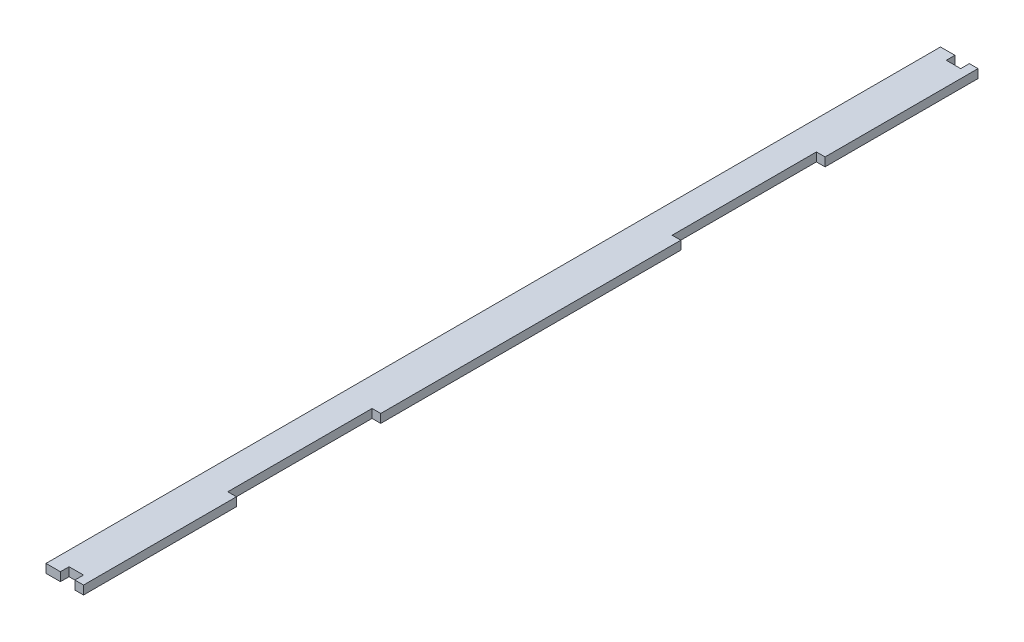
ISO-10303-21;
HEADER;
FILE_DESCRIPTION(('STEP AP214'),'2;1');
FILE_NAME('part.step','',(''),(''),'','','');
FILE_SCHEMA(('AUTOMOTIVE_DESIGN { 1 0 10303 214 1 1 1 1 }'));
ENDSEC;
DATA;
#1=APPLICATION_CONTEXT('core data for automotive mechanical design processes');
#2=APPLICATION_PROTOCOL_DEFINITION('international standard','automotive_design',2000,#1);
#3=PRODUCT_CONTEXT('',#1,'mechanical');
#4=PRODUCT('Part','Part','',(#3));
#5=PRODUCT_RELATED_PRODUCT_CATEGORY('part','',(#4));
#6=PRODUCT_DEFINITION_FORMATION('','',#4);
#7=PRODUCT_DEFINITION_CONTEXT('part definition',#1,'design');
#8=PRODUCT_DEFINITION('design','',#6,#7);
#9=PRODUCT_DEFINITION_SHAPE('','',#8);
#10=(LENGTH_UNIT() NAMED_UNIT(*) SI_UNIT(.MILLI.,.METRE.));
#11=(NAMED_UNIT(*) PLANE_ANGLE_UNIT() SI_UNIT($,.RADIAN.));
#12=(NAMED_UNIT(*) SI_UNIT($,.STERADIAN.) SOLID_ANGLE_UNIT());
#13=UNCERTAINTY_MEASURE_WITH_UNIT(LENGTH_MEASURE(1.E-05),#10,'distance_accuracy_value','');
#14=(GEOMETRIC_REPRESENTATION_CONTEXT(3) GLOBAL_UNCERTAINTY_ASSIGNED_CONTEXT((#13)) GLOBAL_UNIT_ASSIGNED_CONTEXT((#10,
#11,#12)) REPRESENTATION_CONTEXT('',''));
#15=CARTESIAN_POINT('',(0.,0.,0.));
#16=DIRECTION('',(0.,0.,1.));
#17=DIRECTION('',(1.,0.,0.));
#18=AXIS2_PLACEMENT_3D('',#15,#16,#17);
#19=CARTESIAN_POINT('',(1.40934689520758,3.,-179.845654020116));
#20=DIRECTION('',(1.,0.,0.));
#21=DIRECTION('',(0.,0.,-1.));
#22=AXIS2_PLACEMENT_3D('',#19,#20,#21);
#23=PLANE('',#22);
#24=DIRECTION('',(0.,0.,1.));
#25=VECTOR('',#24,1.);
#26=CARTESIAN_POINT('',(1.40934689520758,0.,-179.845654020116));
#27=LINE('',#26,#25);
#28=CARTESIAN_POINT('',(1.40934689520758,0.,-179.845654020116));
#29=VERTEX_POINT('',#28);
#30=CARTESIAN_POINT('',(1.40934689520761,0.,130.154345979884));
#31=VERTEX_POINT('',#30);
#32=EDGE_CURVE('E212',#29,#31,#27,.T.);
#33=ORIENTED_EDGE('',*,*,#32,.T.);
#34=DIRECTION('',(0.,-1.,0.));
#35=VECTOR('',#34,1.);
#36=CARTESIAN_POINT('',(1.40934689520761,3.,130.154345979884));
#37=LINE('',#36,#35);
#38=CARTESIAN_POINT('',(1.40934689520761,3.,130.154345979884));
#39=VERTEX_POINT('',#38);
#40=EDGE_CURVE('E11',#39,#31,#37,.T.);
#41=ORIENTED_EDGE('',*,*,#40,.F.);
#42=DIRECTION('',(0.,0.,1.));
#43=VECTOR('',#42,1.);
#44=CARTESIAN_POINT('',(1.40934689520758,3.,-179.845654020116));
#45=LINE('',#44,#43);
#46=CARTESIAN_POINT('',(1.40934689520758,3.,-179.845654020116));
#47=VERTEX_POINT('',#46);
#48=EDGE_CURVE('E270',#47,#39,#45,.T.);
#49=ORIENTED_EDGE('',*,*,#48,.F.);
#50=DIRECTION('',(0.,-1.,0.));
#51=VECTOR('',#50,1.);
#52=CARTESIAN_POINT('',(1.40934689520758,3.,-179.845654020116));
#53=LINE('',#52,#51);
#54=EDGE_CURVE('E208',#47,#29,#53,.T.);
#55=ORIENTED_EDGE('',*,*,#54,.T.);
#56=EDGE_LOOP('',(#33,#41,#49,#55));
#57=FACE_BOUND('',#56,.T.);
#58=ADVANCED_FACE('F39',(#57),#23,.F.);
#59=CARTESIAN_POINT('',(1.40934689520761,3.,130.154345979884));
#60=DIRECTION('',(0.,0.,-1.));
#61=DIRECTION('',(-1.,0.,0.));
#62=AXIS2_PLACEMENT_3D('',#59,#60,#61);
#63=PLANE('',#62);
#64=DIRECTION('',(1.,0.,0.));
#65=VECTOR('',#64,1.);
#66=CARTESIAN_POINT('',(1.40934689520761,0.,130.154345979884));
#67=LINE('',#66,#65);
#68=CARTESIAN_POINT('',(6.40934689520761,0.,130.154345979884));
#69=VERTEX_POINT('',#68);
#70=EDGE_CURVE('E216',#31,#69,#67,.T.);
#71=ORIENTED_EDGE('',*,*,#70,.T.);
#72=DIRECTION('',(0.,-1.,0.));
#73=VECTOR('',#72,1.);
#74=CARTESIAN_POINT('',(6.40934689520761,3.,130.154345979884));
#75=LINE('',#74,#73);
#76=CARTESIAN_POINT('',(6.40934689520761,3.,130.154345979884));
#77=VERTEX_POINT('',#76);
#78=EDGE_CURVE('E48',#77,#69,#75,.T.);
#79=ORIENTED_EDGE('',*,*,#78,.F.);
#80=DIRECTION('',(1.,0.,0.));
#81=VECTOR('',#80,1.);
#82=CARTESIAN_POINT('',(1.40934689520761,3.,130.154345979884));
#83=LINE('',#82,#81);
#84=EDGE_CURVE('E135',#39,#77,#83,.T.);
#85=ORIENTED_EDGE('',*,*,#84,.F.);
#86=ORIENTED_EDGE('',*,*,#40,.T.);
#87=EDGE_LOOP('',(#71,#79,#85,#86));
#88=FACE_BOUND('',#87,.T.);
#89=ADVANCED_FACE('F420',(#88),#63,.F.);
#90=CARTESIAN_POINT('',(6.40934689520761,3.,130.154345979884));
#91=DIRECTION('',(-1.,0.,0.));
#92=DIRECTION('',(0.,0.,1.));
#93=AXIS2_PLACEMENT_3D('',#90,#91,#92);
#94=PLANE('',#93);
#95=DIRECTION('',(0.,0.,-1.));
#96=VECTOR('',#95,1.);
#97=CARTESIAN_POINT('',(6.40934689520761,0.,130.154345979884));
#98=LINE('',#97,#96);
#99=CARTESIAN_POINT('',(6.40934689520761,0.,127.154345979884));
#100=VERTEX_POINT('',#99);
#101=EDGE_CURVE('E219',#69,#100,#98,.T.);
#102=ORIENTED_EDGE('',*,*,#101,.T.);
#103=DIRECTION('',(0.,-1.,0.));
#104=VECTOR('',#103,1.);
#105=CARTESIAN_POINT('',(6.40934689520761,3.,127.154345979884));
#106=LINE('',#105,#104);
#107=CARTESIAN_POINT('',(6.40934689520761,3.,127.154345979884));
#108=VERTEX_POINT('',#107);
#109=EDGE_CURVE('E329',#108,#100,#106,.T.);
#110=ORIENTED_EDGE('',*,*,#109,.F.);
#111=DIRECTION('',(0.,0.,-1.));
#112=VECTOR('',#111,1.);
#113=CARTESIAN_POINT('',(6.40934689520761,3.,130.154345979884));
#114=LINE('',#113,#112);
#115=EDGE_CURVE('E339',#77,#108,#114,.T.);
#116=ORIENTED_EDGE('',*,*,#115,.F.);
#117=ORIENTED_EDGE('',*,*,#78,.T.);
#118=EDGE_LOOP('',(#102,#110,#116,#117));
#119=FACE_BOUND('',#118,.T.);
#120=ADVANCED_FACE('F337',(#119),#94,.F.);
#121=CARTESIAN_POINT('',(6.40934689520761,3.,127.154345979884));
#122=DIRECTION('',(0.,0.,-1.));
#123=DIRECTION('',(-1.,0.,0.));
#124=AXIS2_PLACEMENT_3D('',#121,#122,#123);
#125=PLANE('',#124);
#126=DIRECTION('',(1.,0.,0.));
#127=VECTOR('',#126,1.);
#128=CARTESIAN_POINT('',(6.40934689520761,0.,127.154345979884));
#129=LINE('',#128,#127);
#130=CARTESIAN_POINT('',(11.4093468952076,0.,127.154345979884));
#131=VERTEX_POINT('',#130);
#132=EDGE_CURVE('E222',#100,#131,#129,.T.);
#133=ORIENTED_EDGE('',*,*,#132,.T.);
#134=DIRECTION('',(0.,-1.,0.));
#135=VECTOR('',#134,1.);
#136=CARTESIAN_POINT('',(11.4093468952076,3.,127.154345979884));
#137=LINE('',#136,#135);
#138=CARTESIAN_POINT('',(11.4093468952076,3.,127.154345979884));
#139=VERTEX_POINT('',#138);
#140=EDGE_CURVE('E325',#139,#131,#137,.T.);
#141=ORIENTED_EDGE('',*,*,#140,.F.);
#142=DIRECTION('',(1.,0.,0.));
#143=VECTOR('',#142,1.);
#144=CARTESIAN_POINT('',(6.40934689520761,3.,127.154345979884));
#145=LINE('',#144,#143);
#146=EDGE_CURVE('E358',#108,#139,#145,.T.);
#147=ORIENTED_EDGE('',*,*,#146,.F.);
#148=ORIENTED_EDGE('',*,*,#109,.T.);
#149=EDGE_LOOP('',(#133,#141,#147,#148));
#150=FACE_BOUND('',#149,.T.);
#151=ADVANCED_FACE('F348',(#150),#125,.F.);
#152=CARTESIAN_POINT('',(11.4093468952076,3.,127.154345979884));
#153=DIRECTION('',(1.,0.,0.));
#154=DIRECTION('',(0.,0.,-1.));
#155=AXIS2_PLACEMENT_3D('',#152,#153,#154);
#156=PLANE('',#155);
#157=DIRECTION('',(0.,0.,1.));
#158=VECTOR('',#157,1.);
#159=CARTESIAN_POINT('',(11.4093468952076,0.,127.154345979884));
#160=LINE('',#159,#158);
#161=CARTESIAN_POINT('',(11.4093468952076,0.,130.154345979884));
#162=VERTEX_POINT('',#161);
#163=EDGE_CURVE('E225',#131,#162,#160,.T.);
#164=ORIENTED_EDGE('',*,*,#163,.T.);
#165=DIRECTION('',(0.,-1.,0.));
#166=VECTOR('',#165,1.);
#167=CARTESIAN_POINT('',(11.4093468952076,3.,130.154345979884));
#168=LINE('',#167,#166);
#169=CARTESIAN_POINT('',(11.4093468952076,3.,130.154345979884));
#170=VERTEX_POINT('',#169);
#171=EDGE_CURVE('E321',#170,#162,#168,.T.);
#172=ORIENTED_EDGE('',*,*,#171,.F.);
#173=DIRECTION('',(0.,0.,1.));
#174=VECTOR('',#173,1.);
#175=CARTESIAN_POINT('',(11.4093468952076,3.,127.154345979884));
#176=LINE('',#175,#174);
#177=EDGE_CURVE('E354',#139,#170,#176,.T.);
#178=ORIENTED_EDGE('',*,*,#177,.F.);
#179=ORIENTED_EDGE('',*,*,#140,.T.);
#180=EDGE_LOOP('',(#164,#172,#178,#179));
#181=FACE_BOUND('',#180,.T.);
#182=ADVANCED_FACE('F352',(#181),#156,.F.);
#183=CARTESIAN_POINT('',(11.4093468952076,3.,130.154345979884));
#184=DIRECTION('',(0.,0.,-1.));
#185=DIRECTION('',(-1.,0.,0.));
#186=AXIS2_PLACEMENT_3D('',#183,#184,#185);
#187=PLANE('',#186);
#188=DIRECTION('',(1.,0.,0.));
#189=VECTOR('',#188,1.);
#190=CARTESIAN_POINT('',(11.4093468952076,0.,130.154345979884));
#191=LINE('',#190,#189);
#192=CARTESIAN_POINT('',(14.4093468952076,0.,130.154345979884));
#193=VERTEX_POINT('',#192);
#194=EDGE_CURVE('E228',#162,#193,#191,.T.);
#195=ORIENTED_EDGE('',*,*,#194,.T.);
#196=DIRECTION('',(0.,-1.,0.));
#197=VECTOR('',#196,1.);
#198=CARTESIAN_POINT('',(14.4093468952076,3.,130.154345979884));
#199=LINE('',#198,#197);
#200=CARTESIAN_POINT('',(14.4093468952076,3.,130.154345979884));
#201=VERTEX_POINT('',#200);
#202=EDGE_CURVE('E317',#201,#193,#199,.T.);
#203=ORIENTED_EDGE('',*,*,#202,.F.);
#204=DIRECTION('',(1.,0.,0.));
#205=VECTOR('',#204,1.);
#206=CARTESIAN_POINT('',(11.4093468952076,3.,130.154345979884));
#207=LINE('',#206,#205);
#208=EDGE_CURVE('E357',#170,#201,#207,.T.);
#209=ORIENTED_EDGE('',*,*,#208,.F.);
#210=ORIENTED_EDGE('',*,*,#171,.T.);
#211=EDGE_LOOP('',(#195,#203,#209,#210));
#212=FACE_BOUND('',#211,.T.);
#213=ADVANCED_FACE('F433',(#212),#187,.F.);
#214=CARTESIAN_POINT('',(14.4093468952076,3.,77.1543459798844));
#215=DIRECTION('',(-1.,0.,0.));
#216=DIRECTION('',(0.,0.,1.));
#217=AXIS2_PLACEMENT_3D('',#214,#215,#216);
#218=PLANE('',#217);
#219=DIRECTION('',(0.,0.,-1.));
#220=VECTOR('',#219,1.);
#221=CARTESIAN_POINT('',(14.4093468952076,0.,77.1543459798844));
#222=LINE('',#221,#220);
#223=CARTESIAN_POINT('',(14.4093468952076,0.,77.1543459798844));
#224=VERTEX_POINT('',#223);
#225=EDGE_CURVE('E231',#193,#224,#222,.T.);
#226=ORIENTED_EDGE('',*,*,#225,.T.);
#227=DIRECTION('',(0.,-1.,0.));
#228=VECTOR('',#227,1.);
#229=CARTESIAN_POINT('',(14.4093468952076,3.,77.1543459798844));
#230=LINE('',#229,#228);
#231=CARTESIAN_POINT('',(14.4093468952076,3.,77.1543459798844));
#232=VERTEX_POINT('',#231);
#233=EDGE_CURVE('E313',#232,#224,#230,.T.);
#234=ORIENTED_EDGE('',*,*,#233,.F.);
#235=DIRECTION('',(0.,0.,-1.));
#236=VECTOR('',#235,1.);
#237=CARTESIAN_POINT('',(14.4093468952076,3.,77.1543459798844));
#238=LINE('',#237,#236);
#239=EDGE_CURVE('E362',#201,#232,#238,.T.);
#240=ORIENTED_EDGE('',*,*,#239,.F.);
#241=ORIENTED_EDGE('',*,*,#202,.T.);
#242=EDGE_LOOP('',(#226,#234,#240,#241));
#243=FACE_BOUND('',#242,.T.);
#244=ADVANCED_FACE('F436',(#243),#218,.F.);
#245=CARTESIAN_POINT('',(14.4093468952076,3.,77.1543459798844));
#246=DIRECTION('',(0.,0.,1.));
#247=DIRECTION('',(1.,0.,0.));
#248=AXIS2_PLACEMENT_3D('',#245,#246,#247);
#249=PLANE('',#248);
#250=DIRECTION('',(-1.,0.,0.));
#251=VECTOR('',#250,1.);
#252=CARTESIAN_POINT('',(14.4093468952076,0.,77.1543459798844));
#253=LINE('',#252,#251);
#254=CARTESIAN_POINT('',(11.4093468952076,0.,77.1543459798844));
#255=VERTEX_POINT('',#254);
#256=EDGE_CURVE('E234',#224,#255,#253,.T.);
#257=ORIENTED_EDGE('',*,*,#256,.T.);
#258=DIRECTION('',(0.,-1.,0.));
#259=VECTOR('',#258,1.);
#260=CARTESIAN_POINT('',(11.4093468952076,3.,77.1543459798844));
#261=LINE('',#260,#259);
#262=CARTESIAN_POINT('',(11.4093468952076,3.,77.1543459798844));
#263=VERTEX_POINT('',#262);
#264=EDGE_CURVE('E309',#263,#255,#261,.T.);
#265=ORIENTED_EDGE('',*,*,#264,.F.);
#266=DIRECTION('',(-1.,0.,0.));
#267=VECTOR('',#266,1.);
#268=CARTESIAN_POINT('',(14.4093468952076,3.,77.1543459798844));
#269=LINE('',#268,#267);
#270=EDGE_CURVE('E369',#232,#263,#269,.T.);
#271=ORIENTED_EDGE('',*,*,#270,.F.);
#272=ORIENTED_EDGE('',*,*,#233,.T.);
#273=EDGE_LOOP('',(#257,#265,#271,#272));
#274=FACE_BOUND('',#273,.T.);
#275=ADVANCED_FACE('F440',(#274),#249,.F.);
#276=CARTESIAN_POINT('',(11.4093468952076,3.,77.1543459798844));
#277=DIRECTION('',(-1.,0.,0.));
#278=DIRECTION('',(0.,0.,1.));
#279=AXIS2_PLACEMENT_3D('',#276,#277,#278);
#280=PLANE('',#279);
#281=DIRECTION('',(0.,0.,-1.));
#282=VECTOR('',#281,1.);
#283=CARTESIAN_POINT('',(11.4093468952076,0.,77.1543459798844));
#284=LINE('',#283,#282);
#285=CARTESIAN_POINT('',(11.4093468952076,0.,27.1543459798844));
#286=VERTEX_POINT('',#285);
#287=EDGE_CURVE('E237',#255,#286,#284,.T.);
#288=ORIENTED_EDGE('',*,*,#287,.T.);
#289=DIRECTION('',(0.,-1.,0.));
#290=VECTOR('',#289,1.);
#291=CARTESIAN_POINT('',(11.4093468952076,3.,27.1543459798844));
#292=LINE('',#291,#290);
#293=CARTESIAN_POINT('',(11.4093468952076,3.,27.1543459798844));
#294=VERTEX_POINT('',#293);
#295=EDGE_CURVE('E305',#294,#286,#292,.T.);
#296=ORIENTED_EDGE('',*,*,#295,.F.);
#297=DIRECTION('',(0.,0.,-1.));
#298=VECTOR('',#297,1.);
#299=CARTESIAN_POINT('',(11.4093468952076,3.,77.1543459798844));
#300=LINE('',#299,#298);
#301=EDGE_CURVE('E372',#263,#294,#300,.T.);
#302=ORIENTED_EDGE('',*,*,#301,.F.);
#303=ORIENTED_EDGE('',*,*,#264,.T.);
#304=EDGE_LOOP('',(#288,#296,#302,#303));
#305=FACE_BOUND('',#304,.T.);
#306=ADVANCED_FACE('F444',(#305),#280,.F.);
#307=CARTESIAN_POINT('',(11.4093468952076,3.,27.1543459798844));
#308=DIRECTION('',(0.,0.,-1.));
#309=DIRECTION('',(-1.,0.,0.));
#310=AXIS2_PLACEMENT_3D('',#307,#308,#309);
#311=PLANE('',#310);
#312=DIRECTION('',(1.,0.,0.));
#313=VECTOR('',#312,1.);
#314=CARTESIAN_POINT('',(11.4093468952076,0.,27.1543459798844));
#315=LINE('',#314,#313);
#316=CARTESIAN_POINT('',(14.4093468952076,0.,27.1543459798844));
#317=VERTEX_POINT('',#316);
#318=EDGE_CURVE('E240',#286,#317,#315,.T.);
#319=ORIENTED_EDGE('',*,*,#318,.T.);
#320=DIRECTION('',(0.,-1.,0.));
#321=VECTOR('',#320,1.);
#322=CARTESIAN_POINT('',(14.4093468952076,3.,27.1543459798844));
#323=LINE('',#322,#321);
#324=CARTESIAN_POINT('',(14.4093468952076,3.,27.1543459798844));
#325=VERTEX_POINT('',#324);
#326=EDGE_CURVE('E301',#325,#317,#323,.T.);
#327=ORIENTED_EDGE('',*,*,#326,.F.);
#328=DIRECTION('',(1.,0.,0.));
#329=VECTOR('',#328,1.);
#330=CARTESIAN_POINT('',(11.4093468952076,3.,27.1543459798844));
#331=LINE('',#330,#329);
#332=EDGE_CURVE('E375',#294,#325,#331,.T.);
#333=ORIENTED_EDGE('',*,*,#332,.F.);
#334=ORIENTED_EDGE('',*,*,#295,.T.);
#335=EDGE_LOOP('',(#319,#327,#333,#334));
#336=FACE_BOUND('',#335,.T.);
#337=ADVANCED_FACE('F448',(#336),#311,.F.);
#338=CARTESIAN_POINT('',(14.4093468952076,3.,-76.8456540201156));
#339=DIRECTION('',(-1.,0.,0.));
#340=DIRECTION('',(0.,0.,1.));
#341=AXIS2_PLACEMENT_3D('',#338,#339,#340);
#342=PLANE('',#341);
#343=DIRECTION('',(0.,0.,-1.));
#344=VECTOR('',#343,1.);
#345=CARTESIAN_POINT('',(14.4093468952076,0.,-76.8456540201156));
#346=LINE('',#345,#344);
#347=CARTESIAN_POINT('',(14.4093468952076,0.,-76.8456540201156));
#348=VERTEX_POINT('',#347);
#349=EDGE_CURVE('E243',#317,#348,#346,.T.);
#350=ORIENTED_EDGE('',*,*,#349,.T.);
#351=DIRECTION('',(0.,-1.,0.));
#352=VECTOR('',#351,1.);
#353=CARTESIAN_POINT('',(14.4093468952076,3.,-76.8456540201156));
#354=LINE('',#353,#352);
#355=CARTESIAN_POINT('',(14.4093468952076,3.,-76.8456540201156));
#356=VERTEX_POINT('',#355);
#357=EDGE_CURVE('E297',#356,#348,#354,.T.);
#358=ORIENTED_EDGE('',*,*,#357,.F.);
#359=DIRECTION('',(0.,0.,-1.));
#360=VECTOR('',#359,1.);
#361=CARTESIAN_POINT('',(14.4093468952076,3.,-76.8456540201156));
#362=LINE('',#361,#360);
#363=EDGE_CURVE('E378',#325,#356,#362,.T.);
#364=ORIENTED_EDGE('',*,*,#363,.F.);
#365=ORIENTED_EDGE('',*,*,#326,.T.);
#366=EDGE_LOOP('',(#350,#358,#364,#365));
#367=FACE_BOUND('',#366,.T.);
#368=ADVANCED_FACE('F452',(#367),#342,.F.);
#369=CARTESIAN_POINT('',(11.4093468952076,3.,-76.8456540201156));
#370=DIRECTION('',(0.,0.,1.));
#371=DIRECTION('',(1.,0.,0.));
#372=AXIS2_PLACEMENT_3D('',#369,#370,#371);
#373=PLANE('',#372);
#374=DIRECTION('',(-1.,0.,0.));
#375=VECTOR('',#374,1.);
#376=CARTESIAN_POINT('',(11.4093468952076,0.,-76.8456540201156));
#377=LINE('',#376,#375);
#378=CARTESIAN_POINT('',(11.4093468952076,0.,-76.8456540201156));
#379=VERTEX_POINT('',#378);
#380=EDGE_CURVE('E246',#348,#379,#377,.T.);
#381=ORIENTED_EDGE('',*,*,#380,.T.);
#382=DIRECTION('',(0.,-1.,0.));
#383=VECTOR('',#382,1.);
#384=CARTESIAN_POINT('',(11.4093468952076,3.,-76.8456540201156));
#385=LINE('',#384,#383);
#386=CARTESIAN_POINT('',(11.4093468952076,3.,-76.8456540201156));
#387=VERTEX_POINT('',#386);
#388=EDGE_CURVE('E293',#387,#379,#385,.T.);
#389=ORIENTED_EDGE('',*,*,#388,.F.);
#390=DIRECTION('',(-1.,0.,0.));
#391=VECTOR('',#390,1.);
#392=CARTESIAN_POINT('',(11.4093468952076,3.,-76.8456540201156));
#393=LINE('',#392,#391);
#394=EDGE_CURVE('E381',#356,#387,#393,.T.);
#395=ORIENTED_EDGE('',*,*,#394,.F.);
#396=ORIENTED_EDGE('',*,*,#357,.T.);
#397=EDGE_LOOP('',(#381,#389,#395,#396));
#398=FACE_BOUND('',#397,.T.);
#399=ADVANCED_FACE('F456',(#398),#373,.F.);
#400=CARTESIAN_POINT('',(11.4093468952076,3.,-126.845654020116));
#401=DIRECTION('',(-1.,0.,0.));
#402=DIRECTION('',(0.,0.,1.));
#403=AXIS2_PLACEMENT_3D('',#400,#401,#402);
#404=PLANE('',#403);
#405=DIRECTION('',(0.,0.,-1.));
#406=VECTOR('',#405,1.);
#407=CARTESIAN_POINT('',(11.4093468952076,0.,-126.845654020116));
#408=LINE('',#407,#406);
#409=CARTESIAN_POINT('',(11.4093468952076,0.,-126.845654020116));
#410=VERTEX_POINT('',#409);
#411=EDGE_CURVE('E249',#379,#410,#408,.T.);
#412=ORIENTED_EDGE('',*,*,#411,.T.);
#413=DIRECTION('',(0.,-1.,0.));
#414=VECTOR('',#413,1.);
#415=CARTESIAN_POINT('',(11.4093468952076,3.,-126.845654020116));
#416=LINE('',#415,#414);
#417=CARTESIAN_POINT('',(11.4093468952076,3.,-126.845654020116));
#418=VERTEX_POINT('',#417);
#419=EDGE_CURVE('E289',#418,#410,#416,.T.);
#420=ORIENTED_EDGE('',*,*,#419,.F.);
#421=DIRECTION('',(0.,0.,-1.));
#422=VECTOR('',#421,1.);
#423=CARTESIAN_POINT('',(11.4093468952076,3.,-126.845654020116));
#424=LINE('',#423,#422);
#425=EDGE_CURVE('E384',#387,#418,#424,.T.);
#426=ORIENTED_EDGE('',*,*,#425,.F.);
#427=ORIENTED_EDGE('',*,*,#388,.T.);
#428=EDGE_LOOP('',(#412,#420,#426,#427));
#429=FACE_BOUND('',#428,.T.);
#430=ADVANCED_FACE('F460',(#429),#404,.F.);
#431=CARTESIAN_POINT('',(14.4093468952076,3.,-126.845654020116));
#432=DIRECTION('',(0.,0.,-1.));
#433=DIRECTION('',(-1.,0.,0.));
#434=AXIS2_PLACEMENT_3D('',#431,#432,#433);
#435=PLANE('',#434);
#436=DIRECTION('',(1.,0.,0.));
#437=VECTOR('',#436,1.);
#438=CARTESIAN_POINT('',(14.4093468952076,0.,-126.845654020116));
#439=LINE('',#438,#437);
#440=CARTESIAN_POINT('',(14.4093468952076,0.,-126.845654020116));
#441=VERTEX_POINT('',#440);
#442=EDGE_CURVE('E252',#410,#441,#439,.T.);
#443=ORIENTED_EDGE('',*,*,#442,.T.);
#444=DIRECTION('',(0.,-1.,0.));
#445=VECTOR('',#444,1.);
#446=CARTESIAN_POINT('',(14.4093468952076,3.,-126.845654020116));
#447=LINE('',#446,#445);
#448=CARTESIAN_POINT('',(14.4093468952076,3.,-126.845654020116));
#449=VERTEX_POINT('',#448);
#450=EDGE_CURVE('E285',#449,#441,#447,.T.);
#451=ORIENTED_EDGE('',*,*,#450,.F.);
#452=DIRECTION('',(1.,0.,0.));
#453=VECTOR('',#452,1.);
#454=CARTESIAN_POINT('',(14.4093468952076,3.,-126.845654020116));
#455=LINE('',#454,#453);
#456=EDGE_CURVE('E387',#418,#449,#455,.T.);
#457=ORIENTED_EDGE('',*,*,#456,.F.);
#458=ORIENTED_EDGE('',*,*,#419,.T.);
#459=EDGE_LOOP('',(#443,#451,#457,#458));
#460=FACE_BOUND('',#459,.T.);
#461=ADVANCED_FACE('F464',(#460),#435,.F.);
#462=CARTESIAN_POINT('',(14.4093468952076,3.,-179.845654020116));
#463=DIRECTION('',(-1.,0.,0.));
#464=DIRECTION('',(0.,0.,1.));
#465=AXIS2_PLACEMENT_3D('',#462,#463,#464);
#466=PLANE('',#465);
#467=DIRECTION('',(0.,0.,-1.));
#468=VECTOR('',#467,1.);
#469=CARTESIAN_POINT('',(14.4093468952076,0.,-179.845654020116));
#470=LINE('',#469,#468);
#471=CARTESIAN_POINT('',(14.4093468952076,0.,-179.845654020116));
#472=VERTEX_POINT('',#471);
#473=EDGE_CURVE('E255',#441,#472,#470,.T.);
#474=ORIENTED_EDGE('',*,*,#473,.T.);
#475=DIRECTION('',(0.,-1.,0.));
#476=VECTOR('',#475,1.);
#477=CARTESIAN_POINT('',(14.4093468952076,3.,-179.845654020116));
#478=LINE('',#477,#476);
#479=CARTESIAN_POINT('',(14.4093468952076,3.,-179.845654020116));
#480=VERTEX_POINT('',#479);
#481=EDGE_CURVE('E281',#480,#472,#478,.T.);
#482=ORIENTED_EDGE('',*,*,#481,.F.);
#483=DIRECTION('',(0.,0.,-1.));
#484=VECTOR('',#483,1.);
#485=CARTESIAN_POINT('',(14.4093468952076,3.,-179.845654020116));
#486=LINE('',#485,#484);
#487=EDGE_CURVE('E390',#449,#480,#486,.T.);
#488=ORIENTED_EDGE('',*,*,#487,.F.);
#489=ORIENTED_EDGE('',*,*,#450,.T.);
#490=EDGE_LOOP('',(#474,#482,#488,#489));
#491=FACE_BOUND('',#490,.T.);
#492=ADVANCED_FACE('F468',(#491),#466,.F.);
#493=CARTESIAN_POINT('',(11.4093468952076,3.,-179.845654020116));
#494=DIRECTION('',(0.,0.,1.));
#495=DIRECTION('',(1.,0.,0.));
#496=AXIS2_PLACEMENT_3D('',#493,#494,#495);
#497=PLANE('',#496);
#498=DIRECTION('',(-1.,0.,0.));
#499=VECTOR('',#498,1.);
#500=CARTESIAN_POINT('',(11.4093468952076,0.,-179.845654020116));
#501=LINE('',#500,#499);
#502=CARTESIAN_POINT('',(11.4093468952076,0.,-179.845654020116));
#503=VERTEX_POINT('',#502);
#504=EDGE_CURVE('E258',#472,#503,#501,.T.);
#505=ORIENTED_EDGE('',*,*,#504,.T.);
#506=DIRECTION('',(0.,-1.,0.));
#507=VECTOR('',#506,1.);
#508=CARTESIAN_POINT('',(11.4093468952076,3.,-179.845654020116));
#509=LINE('',#508,#507);
#510=CARTESIAN_POINT('',(11.4093468952076,3.,-179.845654020116));
#511=VERTEX_POINT('',#510);
#512=EDGE_CURVE('E277',#511,#503,#509,.T.);
#513=ORIENTED_EDGE('',*,*,#512,.F.);
#514=DIRECTION('',(-1.,0.,0.));
#515=VECTOR('',#514,1.);
#516=CARTESIAN_POINT('',(11.4093468952076,3.,-179.845654020116));
#517=LINE('',#516,#515);
#518=EDGE_CURVE('E393',#480,#511,#517,.T.);
#519=ORIENTED_EDGE('',*,*,#518,.F.);
#520=ORIENTED_EDGE('',*,*,#481,.T.);
#521=EDGE_LOOP('',(#505,#513,#519,#520));
#522=FACE_BOUND('',#521,.T.);
#523=ADVANCED_FACE('F401',(#522),#497,.F.);
#524=CARTESIAN_POINT('',(11.4093468952076,3.,-176.845654020116));
#525=DIRECTION('',(1.,0.,0.));
#526=DIRECTION('',(0.,0.,-1.));
#527=AXIS2_PLACEMENT_3D('',#524,#525,#526);
#528=PLANE('',#527);
#529=DIRECTION('',(0.,0.,1.));
#530=VECTOR('',#529,1.);
#531=CARTESIAN_POINT('',(11.4093468952076,0.,-176.845654020116));
#532=LINE('',#531,#530);
#533=CARTESIAN_POINT('',(11.4093468952076,0.,-176.845654020116));
#534=VERTEX_POINT('',#533);
#535=EDGE_CURVE('E261',#503,#534,#532,.T.);
#536=ORIENTED_EDGE('',*,*,#535,.T.);
#537=DIRECTION('',(0.,-1.,0.));
#538=VECTOR('',#537,1.);
#539=CARTESIAN_POINT('',(11.4093468952076,3.,-176.845654020116));
#540=LINE('',#539,#538);
#541=CARTESIAN_POINT('',(11.4093468952076,3.,-176.845654020116));
#542=VERTEX_POINT('',#541);
#543=EDGE_CURVE('E201',#542,#534,#540,.T.);
#544=ORIENTED_EDGE('',*,*,#543,.F.);
#545=DIRECTION('',(0.,0.,1.));
#546=VECTOR('',#545,1.);
#547=CARTESIAN_POINT('',(11.4093468952076,3.,-176.845654020116));
#548=LINE('',#547,#546);
#549=EDGE_CURVE('E190',#511,#542,#548,.T.);
#550=ORIENTED_EDGE('',*,*,#549,.F.);
#551=ORIENTED_EDGE('',*,*,#512,.T.);
#552=EDGE_LOOP('',(#536,#544,#550,#551));
#553=FACE_BOUND('',#552,.T.);
#554=ADVANCED_FACE('F405',(#553),#528,.F.);
#555=CARTESIAN_POINT('',(6.40934689520758,3.,-176.845654020116));
#556=DIRECTION('',(0.,0.,1.));
#557=DIRECTION('',(1.,0.,0.));
#558=AXIS2_PLACEMENT_3D('',#555,#556,#557);
#559=PLANE('',#558);
#560=DIRECTION('',(-1.,0.,0.));
#561=VECTOR('',#560,1.);
#562=CARTESIAN_POINT('',(6.40934689520758,0.,-176.845654020116));
#563=LINE('',#562,#561);
#564=CARTESIAN_POINT('',(6.40934689520758,0.,-176.845654020116));
#565=VERTEX_POINT('',#564);
#566=EDGE_CURVE('E199',#534,#565,#563,.T.);
#567=ORIENTED_EDGE('',*,*,#566,.T.);
#568=DIRECTION('',(0.,-1.,0.));
#569=VECTOR('',#568,1.);
#570=CARTESIAN_POINT('',(6.40934689520758,3.,-176.845654020116));
#571=LINE('',#570,#569);
#572=CARTESIAN_POINT('',(6.40934689520758,3.,-176.845654020116));
#573=VERTEX_POINT('',#572);
#574=EDGE_CURVE('E196',#573,#565,#571,.T.);
#575=ORIENTED_EDGE('',*,*,#574,.F.);
#576=DIRECTION('',(-1.,0.,0.));
#577=VECTOR('',#576,1.);
#578=CARTESIAN_POINT('',(6.40934689520758,3.,-176.845654020116));
#579=LINE('',#578,#577);
#580=EDGE_CURVE('E184',#542,#573,#579,.T.);
#581=ORIENTED_EDGE('',*,*,#580,.F.);
#582=ORIENTED_EDGE('',*,*,#543,.T.);
#583=EDGE_LOOP('',(#567,#575,#581,#582));
#584=FACE_BOUND('',#583,.T.);
#585=ADVANCED_FACE('F197',(#584),#559,.F.);
#586=CARTESIAN_POINT('',(6.40934689520758,3.,-179.845654020116));
#587=DIRECTION('',(-1.,0.,0.));
#588=DIRECTION('',(0.,0.,1.));
#589=AXIS2_PLACEMENT_3D('',#586,#587,#588);
#590=PLANE('',#589);
#591=DIRECTION('',(0.,0.,-1.));
#592=VECTOR('',#591,1.);
#593=CARTESIAN_POINT('',(6.40934689520758,0.,-179.845654020116));
#594=LINE('',#593,#592);
#595=CARTESIAN_POINT('',(6.40934689520758,0.,-179.845654020116));
#596=VERTEX_POINT('',#595);
#597=EDGE_CURVE('E121',#565,#596,#594,.T.);
#598=ORIENTED_EDGE('',*,*,#597,.T.);
#599=DIRECTION('',(0.,-1.,0.));
#600=VECTOR('',#599,1.);
#601=CARTESIAN_POINT('',(6.40934689520758,3.,-179.845654020116));
#602=LINE('',#601,#600);
#603=CARTESIAN_POINT('',(6.40934689520758,3.,-179.845654020116));
#604=VERTEX_POINT('',#603);
#605=EDGE_CURVE('E202',#604,#596,#602,.T.);
#606=ORIENTED_EDGE('',*,*,#605,.F.);
#607=DIRECTION('',(0.,0.,-1.));
#608=VECTOR('',#607,1.);
#609=CARTESIAN_POINT('',(6.40934689520758,3.,-179.845654020116));
#610=LINE('',#609,#608);
#611=EDGE_CURVE('E188',#573,#604,#610,.T.);
#612=ORIENTED_EDGE('',*,*,#611,.F.);
#613=ORIENTED_EDGE('',*,*,#574,.T.);
#614=EDGE_LOOP('',(#598,#606,#612,#613));
#615=FACE_BOUND('',#614,.T.);
#616=ADVANCED_FACE('F204',(#615),#590,.F.);
#617=CARTESIAN_POINT('',(1.40934689520758,3.,-179.845654020116));
#618=DIRECTION('',(0.,0.,1.));
#619=DIRECTION('',(1.,0.,0.));
#620=AXIS2_PLACEMENT_3D('',#617,#618,#619);
#621=PLANE('',#620);
#622=DIRECTION('',(-1.,0.,0.));
#623=VECTOR('',#622,1.);
#624=CARTESIAN_POINT('',(1.40934689520758,0.,-179.845654020116));
#625=LINE('',#624,#623);
#626=EDGE_CURVE('E127',#596,#29,#625,.T.);
#627=ORIENTED_EDGE('',*,*,#626,.T.);
#628=ORIENTED_EDGE('',*,*,#54,.F.);
#629=DIRECTION('',(-1.,0.,0.));
#630=VECTOR('',#629,1.);
#631=CARTESIAN_POINT('',(1.40934689520758,3.,-179.845654020116));
#632=LINE('',#631,#630);
#633=EDGE_CURVE('E56',#604,#47,#632,.T.);
#634=ORIENTED_EDGE('',*,*,#633,.F.);
#635=ORIENTED_EDGE('',*,*,#605,.T.);
#636=EDGE_LOOP('',(#627,#628,#634,#635));
#637=FACE_BOUND('',#636,.T.);
#638=ADVANCED_FACE('F409',(#637),#621,.F.);
#639=CARTESIAN_POINT('',(0.,3.,0.));
#640=DIRECTION('',(0.,1.,0.));
#641=DIRECTION('',(0.,0.,1.));
#642=AXIS2_PLACEMENT_3D('',#639,#640,#641);
#643=PLANE('',#642);
#644=ORIENTED_EDGE('',*,*,#48,.T.);
#645=ORIENTED_EDGE('',*,*,#84,.T.);
#646=ORIENTED_EDGE('',*,*,#115,.T.);
#647=ORIENTED_EDGE('',*,*,#146,.T.);
#648=ORIENTED_EDGE('',*,*,#177,.T.);
#649=ORIENTED_EDGE('',*,*,#208,.T.);
#650=ORIENTED_EDGE('',*,*,#239,.T.);
#651=ORIENTED_EDGE('',*,*,#270,.T.);
#652=ORIENTED_EDGE('',*,*,#301,.T.);
#653=ORIENTED_EDGE('',*,*,#332,.T.);
#654=ORIENTED_EDGE('',*,*,#363,.T.);
#655=ORIENTED_EDGE('',*,*,#394,.T.);
#656=ORIENTED_EDGE('',*,*,#425,.T.);
#657=ORIENTED_EDGE('',*,*,#456,.T.);
#658=ORIENTED_EDGE('',*,*,#487,.T.);
#659=ORIENTED_EDGE('',*,*,#518,.T.);
#660=ORIENTED_EDGE('',*,*,#549,.T.);
#661=ORIENTED_EDGE('',*,*,#580,.T.);
#662=ORIENTED_EDGE('',*,*,#611,.T.);
#663=ORIENTED_EDGE('',*,*,#633,.T.);
#664=EDGE_LOOP('',(#644,#645,#646,#647,#648,#649,#650,#651,#652,#653,#654,#655,#656,#657,#658,
#659,#660,#661,#662,#663));
#665=FACE_BOUND('',#664,.T.);
#666=ADVANCED_FACE('F186',(#665),#643,.T.);
#667=CARTESIAN_POINT('',(0.,0.,0.));
#668=DIRECTION('',(0.,1.,0.));
#669=DIRECTION('',(0.,0.,1.));
#670=AXIS2_PLACEMENT_3D('',#667,#668,#669);
#671=PLANE('',#670);
#672=ORIENTED_EDGE('',*,*,#32,.F.);
#673=ORIENTED_EDGE('',*,*,#626,.F.);
#674=ORIENTED_EDGE('',*,*,#597,.F.);
#675=ORIENTED_EDGE('',*,*,#566,.F.);
#676=ORIENTED_EDGE('',*,*,#535,.F.);
#677=ORIENTED_EDGE('',*,*,#504,.F.);
#678=ORIENTED_EDGE('',*,*,#473,.F.);
#679=ORIENTED_EDGE('',*,*,#442,.F.);
#680=ORIENTED_EDGE('',*,*,#411,.F.);
#681=ORIENTED_EDGE('',*,*,#380,.F.);
#682=ORIENTED_EDGE('',*,*,#349,.F.);
#683=ORIENTED_EDGE('',*,*,#318,.F.);
#684=ORIENTED_EDGE('',*,*,#287,.F.);
#685=ORIENTED_EDGE('',*,*,#256,.F.);
#686=ORIENTED_EDGE('',*,*,#225,.F.);
#687=ORIENTED_EDGE('',*,*,#194,.F.);
#688=ORIENTED_EDGE('',*,*,#163,.F.);
#689=ORIENTED_EDGE('',*,*,#132,.F.);
#690=ORIENTED_EDGE('',*,*,#101,.F.);
#691=ORIENTED_EDGE('',*,*,#70,.F.);
#692=EDGE_LOOP('',(#672,#673,#674,#675,#676,#677,#678,#679,#680,#681,#682,#683,#684,#685,#686,
#687,#688,#689,#690,#691));
#693=FACE_BOUND('',#692,.T.);
#694=ADVANCED_FACE('F343',(#693),#671,.F.);
#695=CLOSED_SHELL('',(#58,#89,#120,#151,#182,#213,#244,#275,#306,#337,#368,#399,#430,#461,#492,
#523,#554,#585,#616,#638,#666,#694));
#696=MANIFOLD_SOLID_BREP('B2',#695);
#697=ADVANCED_BREP_SHAPE_REPRESENTATION('',(#18,#696),#14);
#698=SHAPE_DEFINITION_REPRESENTATION(#9,#697);
ENDSEC;
END-ISO-10303-21;
